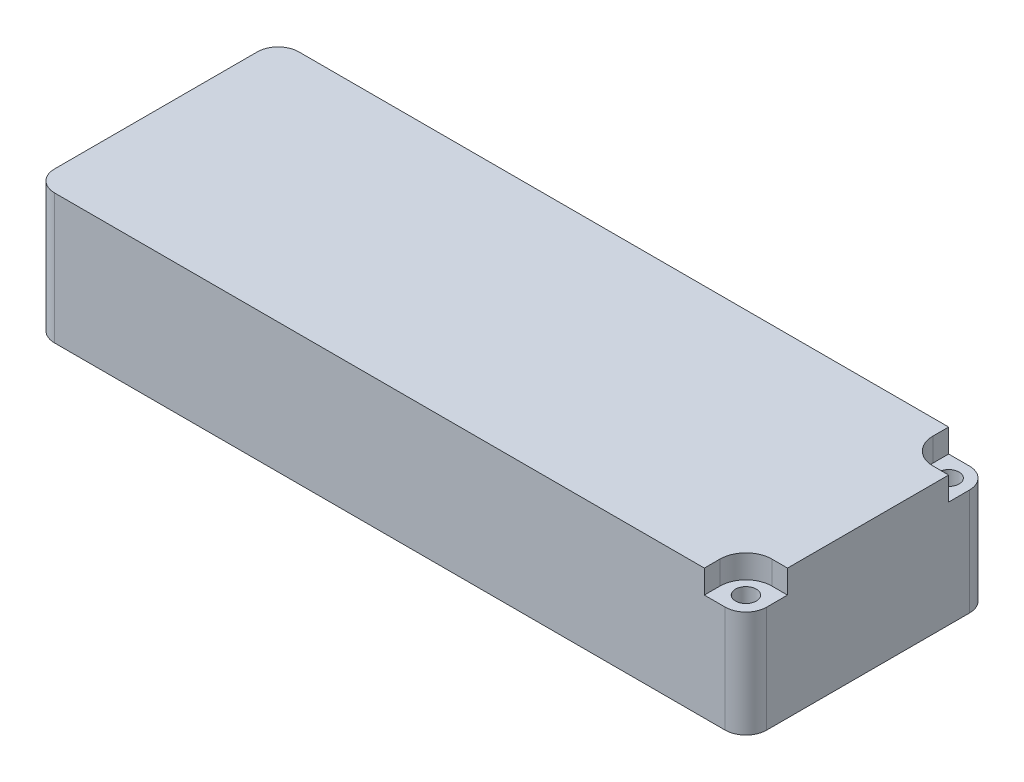
ISO-10303-21;
HEADER;
FILE_DESCRIPTION(('STEP AP214'),'2;1');
FILE_NAME('part.step','',(''),(''),'','','');
FILE_SCHEMA(('AUTOMOTIVE_DESIGN { 1 0 10303 214 1 1 1 1 }'));
ENDSEC;
DATA;
#1=APPLICATION_CONTEXT('core data for automotive mechanical design processes');
#2=APPLICATION_PROTOCOL_DEFINITION('international standard','automotive_design',2000,#1);
#3=PRODUCT_CONTEXT('',#1,'mechanical');
#4=PRODUCT('Part','Part','',(#3));
#5=PRODUCT_RELATED_PRODUCT_CATEGORY('part','',(#4));
#6=PRODUCT_DEFINITION_FORMATION('','',#4);
#7=PRODUCT_DEFINITION_CONTEXT('part definition',#1,'design');
#8=PRODUCT_DEFINITION('design','',#6,#7);
#9=PRODUCT_DEFINITION_SHAPE('','',#8);
#10=(LENGTH_UNIT() NAMED_UNIT(*) SI_UNIT(.MILLI.,.METRE.));
#11=(NAMED_UNIT(*) PLANE_ANGLE_UNIT() SI_UNIT($,.RADIAN.));
#12=(NAMED_UNIT(*) SI_UNIT($,.STERADIAN.) SOLID_ANGLE_UNIT());
#13=UNCERTAINTY_MEASURE_WITH_UNIT(LENGTH_MEASURE(1.E-05),#10,'distance_accuracy_value','');
#14=(GEOMETRIC_REPRESENTATION_CONTEXT(3) GLOBAL_UNCERTAINTY_ASSIGNED_CONTEXT((#13)) GLOBAL_UNIT_ASSIGNED_CONTEXT((#10,
#11,#12)) REPRESENTATION_CONTEXT('',''));
#15=CARTESIAN_POINT('',(0.,0.,0.));
#16=DIRECTION('',(0.,0.,1.));
#17=DIRECTION('',(1.,0.,0.));
#18=AXIS2_PLACEMENT_3D('',#15,#16,#17);
#19=CARTESIAN_POINT('',(64.5,25.,-19.5));
#20=DIRECTION('',(0.,1.,0.));
#21=DIRECTION('',(0.,0.,1.));
#22=AXIS2_PLACEMENT_3D('',#19,#20,#21);
#23=CYLINDRICAL_SURFACE('',#22,4.);
#24=DIRECTION('',(0.,-1.,0.));
#25=VECTOR('',#24,1.);
#26=CARTESIAN_POINT('',(64.5,0.,-23.5));
#27=LINE('',#26,#25);
#28=CARTESIAN_POINT('',(64.5,20.5,-23.5));
#29=VERTEX_POINT('',#28);
#30=CARTESIAN_POINT('',(64.5,0.,-23.5));
#31=VERTEX_POINT('',#30);
#32=EDGE_CURVE('E226',#29,#31,#27,.T.);
#33=ORIENTED_EDGE('',*,*,#32,.F.);
#34=CARTESIAN_POINT('',(64.5,20.5,-19.5));
#35=DIRECTION('',(0.,1.,0.));
#36=DIRECTION('',(0.,0.,1.));
#37=AXIS2_PLACEMENT_3D('',#34,#35,#36);
#38=CIRCLE('',#37,4.);
#39=CARTESIAN_POINT('',(68.5,20.5,-19.5));
#40=VERTEX_POINT('',#39);
#41=EDGE_CURVE('E245',#29,#40,#38,.F.);
#42=ORIENTED_EDGE('',*,*,#41,.T.);
#43=DIRECTION('',(0.,-1.,0.));
#44=VECTOR('',#43,1.);
#45=CARTESIAN_POINT('',(68.5,25.,-19.5));
#46=LINE('',#45,#44);
#47=CARTESIAN_POINT('',(68.5,0.,-19.5));
#48=VERTEX_POINT('',#47);
#49=EDGE_CURVE('E236',#48,#40,#46,.F.);
#50=ORIENTED_EDGE('',*,*,#49,.F.);
#51=CARTESIAN_POINT('',(64.5,0.,-19.5));
#52=DIRECTION('',(0.,-1.,0.));
#53=DIRECTION('',(0.,0.,-1.));
#54=AXIS2_PLACEMENT_3D('',#51,#52,#53);
#55=CIRCLE('',#54,4.);
#56=EDGE_CURVE('E222',#31,#48,#55,.T.);
#57=ORIENTED_EDGE('',*,*,#56,.F.);
#58=EDGE_LOOP('',(#33,#42,#50,#57));
#59=FACE_BOUND('',#58,.T.);
#60=ADVANCED_FACE('F33',(#59),#23,.T.);
#61=CARTESIAN_POINT('',(-68.5,25.,23.5));
#62=DIRECTION('',(-1.,0.,0.));
#63=DIRECTION('',(0.,0.,1.));
#64=AXIS2_PLACEMENT_3D('',#61,#62,#63);
#65=PLANE('',#64);
#66=DIRECTION('',(0.,0.,-1.));
#67=VECTOR('',#66,1.);
#68=CARTESIAN_POINT('',(-68.5,25.,23.5));
#69=LINE('',#68,#67);
#70=CARTESIAN_POINT('',(-68.5,25.,19.5));
#71=VERTEX_POINT('',#70);
#72=CARTESIAN_POINT('',(-68.5,25.,-19.5));
#73=VERTEX_POINT('',#72);
#74=EDGE_CURVE('E192',#71,#73,#69,.T.);
#75=ORIENTED_EDGE('',*,*,#74,.T.);
#76=DIRECTION('',(0.,-1.,0.));
#77=VECTOR('',#76,1.);
#78=CARTESIAN_POINT('',(-68.5,25.,-19.5));
#79=LINE('',#78,#77);
#80=CARTESIAN_POINT('',(-68.5,0.,-19.5));
#81=VERTEX_POINT('',#80);
#82=EDGE_CURVE('E215',#73,#81,#79,.T.);
#83=ORIENTED_EDGE('',*,*,#82,.T.);
#84=DIRECTION('',(0.,0.,-1.));
#85=VECTOR('',#84,1.);
#86=CARTESIAN_POINT('',(-68.5,0.,23.5));
#87=LINE('',#86,#85);
#88=CARTESIAN_POINT('',(-68.5,0.,19.5));
#89=VERTEX_POINT('',#88);
#90=EDGE_CURVE('E190',#89,#81,#87,.T.);
#91=ORIENTED_EDGE('',*,*,#90,.F.);
#92=DIRECTION('',(0.,-1.,0.));
#93=VECTOR('',#92,1.);
#94=CARTESIAN_POINT('',(-68.5,25.,19.5));
#95=LINE('',#94,#93);
#96=EDGE_CURVE('E203',#89,#71,#95,.F.);
#97=ORIENTED_EDGE('',*,*,#96,.T.);
#98=EDGE_LOOP('',(#75,#83,#91,#97));
#99=FACE_BOUND('',#98,.T.);
#100=ADVANCED_FACE('F297',(#99),#65,.T.);
#101=CARTESIAN_POINT('',(-68.5,25.,23.5));
#102=DIRECTION('',(0.,0.,-1.));
#103=DIRECTION('',(-1.,0.,0.));
#104=AXIS2_PLACEMENT_3D('',#101,#102,#103);
#105=PLANE('',#104);
#106=DIRECTION('',(1.,0.,0.));
#107=VECTOR('',#106,1.);
#108=CARTESIAN_POINT('',(68.5,20.5,23.5));
#109=LINE('',#108,#107);
#110=CARTESIAN_POINT('',(60.5,20.5,23.5));
#111=VERTEX_POINT('',#110);
#112=CARTESIAN_POINT('',(64.5,20.5,23.5));
#113=VERTEX_POINT('',#112);
#114=EDGE_CURVE('E166',#111,#113,#109,.T.);
#115=ORIENTED_EDGE('',*,*,#114,.F.);
#116=DIRECTION('',(0.,1.,0.));
#117=VECTOR('',#116,1.);
#118=CARTESIAN_POINT('',(60.5,20.5,23.5));
#119=LINE('',#118,#117);
#120=CARTESIAN_POINT('',(60.5,25.,23.5));
#121=VERTEX_POINT('',#120);
#122=EDGE_CURVE('E165',#111,#121,#119,.T.);
#123=ORIENTED_EDGE('',*,*,#122,.T.);
#124=DIRECTION('',(1.,0.,0.));
#125=VECTOR('',#124,1.);
#126=CARTESIAN_POINT('',(-68.5,25.,23.5));
#127=LINE('',#126,#125);
#128=CARTESIAN_POINT('',(-64.5,25.,23.5));
#129=VERTEX_POINT('',#128);
#130=EDGE_CURVE('E200',#129,#121,#127,.T.);
#131=ORIENTED_EDGE('',*,*,#130,.F.);
#132=DIRECTION('',(0.,-1.,0.));
#133=VECTOR('',#132,1.);
#134=CARTESIAN_POINT('',(-64.5,0.,23.5));
#135=LINE('',#134,#133);
#136=CARTESIAN_POINT('',(-64.5,0.,23.5));
#137=VERTEX_POINT('',#136);
#138=EDGE_CURVE('E239',#129,#137,#135,.T.);
#139=ORIENTED_EDGE('',*,*,#138,.T.);
#140=DIRECTION('',(1.,0.,0.));
#141=VECTOR('',#140,1.);
#142=CARTESIAN_POINT('',(-68.5,0.,23.5));
#143=LINE('',#142,#141);
#144=CARTESIAN_POINT('',(64.5,0.,23.5));
#145=VERTEX_POINT('',#144);
#146=EDGE_CURVE('E196',#137,#145,#143,.T.);
#147=ORIENTED_EDGE('',*,*,#146,.T.);
#148=DIRECTION('',(0.,-1.,0.));
#149=VECTOR('',#148,1.);
#150=CARTESIAN_POINT('',(64.5,25.,23.5));
#151=LINE('',#150,#149);
#152=EDGE_CURVE('E242',#145,#113,#151,.F.);
#153=ORIENTED_EDGE('',*,*,#152,.T.);
#154=EDGE_LOOP('',(#115,#123,#131,#139,#147,#153));
#155=FACE_BOUND('',#154,.T.);
#156=ADVANCED_FACE('F309',(#155),#105,.F.);
#157=CARTESIAN_POINT('',(68.5,25.,23.5));
#158=DIRECTION('',(-1.,0.,0.));
#159=DIRECTION('',(0.,0.,1.));
#160=AXIS2_PLACEMENT_3D('',#157,#158,#159);
#161=PLANE('',#160);
#162=DIRECTION('',(0.,0.,-1.));
#163=VECTOR('',#162,1.);
#164=CARTESIAN_POINT('',(68.5,25.,23.5));
#165=LINE('',#164,#163);
#166=CARTESIAN_POINT('',(68.5,25.,15.5));
#167=VERTEX_POINT('',#166);
#168=CARTESIAN_POINT('',(68.5,25.,-15.5));
#169=VERTEX_POINT('',#168);
#170=EDGE_CURVE('E164',#167,#169,#165,.T.);
#171=ORIENTED_EDGE('',*,*,#170,.F.);
#172=DIRECTION('',(0.,1.,0.));
#173=VECTOR('',#172,1.);
#174=CARTESIAN_POINT('',(68.5,20.5,15.5));
#175=LINE('',#174,#173);
#176=CARTESIAN_POINT('',(68.5,20.5,15.5));
#177=VERTEX_POINT('',#176);
#178=EDGE_CURVE('E157',#177,#167,#175,.T.);
#179=ORIENTED_EDGE('',*,*,#178,.F.);
#180=DIRECTION('',(0.,0.,-1.));
#181=VECTOR('',#180,1.);
#182=CARTESIAN_POINT('',(68.5,20.5,15.5));
#183=LINE('',#182,#181);
#184=CARTESIAN_POINT('',(68.5,20.5,19.5));
#185=VERTEX_POINT('',#184);
#186=EDGE_CURVE('E145',#185,#177,#183,.T.);
#187=ORIENTED_EDGE('',*,*,#186,.F.);
#188=DIRECTION('',(0.,-1.,0.));
#189=VECTOR('',#188,1.);
#190=CARTESIAN_POINT('',(68.5,25.,19.5));
#191=LINE('',#190,#189);
#192=CARTESIAN_POINT('',(68.5,0.,19.5));
#193=VERTEX_POINT('',#192);
#194=EDGE_CURVE('E234',#185,#193,#191,.T.);
#195=ORIENTED_EDGE('',*,*,#194,.T.);
#196=DIRECTION('',(0.,0.,-1.));
#197=VECTOR('',#196,1.);
#198=CARTESIAN_POINT('',(68.5,0.,23.5));
#199=LINE('',#198,#197);
#200=EDGE_CURVE('E209',#193,#48,#199,.T.);
#201=ORIENTED_EDGE('',*,*,#200,.T.);
#202=ORIENTED_EDGE('',*,*,#49,.T.);
#203=DIRECTION('',(0.,0.,-1.));
#204=VECTOR('',#203,1.);
#205=CARTESIAN_POINT('',(68.5,20.5,-15.5));
#206=LINE('',#205,#204);
#207=CARTESIAN_POINT('',(68.5,20.5,-15.5));
#208=VERTEX_POINT('',#207);
#209=EDGE_CURVE('E182',#208,#40,#206,.T.);
#210=ORIENTED_EDGE('',*,*,#209,.F.);
#211=DIRECTION('',(0.,1.,0.));
#212=VECTOR('',#211,1.);
#213=CARTESIAN_POINT('',(68.5,20.5,-15.5));
#214=LINE('',#213,#212);
#215=EDGE_CURVE('E188',#208,#169,#214,.T.);
#216=ORIENTED_EDGE('',*,*,#215,.T.);
#217=EDGE_LOOP('',(#171,#179,#187,#195,#201,#202,#210,#216));
#218=FACE_BOUND('',#217,.T.);
#219=ADVANCED_FACE('F161',(#218),#161,.F.);
#220=CARTESIAN_POINT('',(-68.5,25.,-23.5));
#221=DIRECTION('',(0.,0.,-1.));
#222=DIRECTION('',(-1.,0.,0.));
#223=AXIS2_PLACEMENT_3D('',#220,#221,#222);
#224=PLANE('',#223);
#225=DIRECTION('',(0.,1.,0.));
#226=VECTOR('',#225,1.);
#227=CARTESIAN_POINT('',(60.5,20.5,-23.5));
#228=LINE('',#227,#226);
#229=CARTESIAN_POINT('',(60.5,20.5,-23.5));
#230=VERTEX_POINT('',#229);
#231=CARTESIAN_POINT('',(60.5,25.,-23.5));
#232=VERTEX_POINT('',#231);
#233=EDGE_CURVE('E184',#230,#232,#228,.T.);
#234=ORIENTED_EDGE('',*,*,#233,.F.);
#235=DIRECTION('',(-1.,0.,0.));
#236=VECTOR('',#235,1.);
#237=CARTESIAN_POINT('',(68.5,20.5,-23.5));
#238=LINE('',#237,#236);
#239=EDGE_CURVE('E174',#29,#230,#238,.T.);
#240=ORIENTED_EDGE('',*,*,#239,.F.);
#241=ORIENTED_EDGE('',*,*,#32,.T.);
#242=DIRECTION('',(1.,0.,0.));
#243=VECTOR('',#242,1.);
#244=CARTESIAN_POINT('',(-68.5,0.,-23.5));
#245=LINE('',#244,#243);
#246=CARTESIAN_POINT('',(-64.5,0.,-23.5));
#247=VERTEX_POINT('',#246);
#248=EDGE_CURVE('E206',#247,#31,#245,.T.);
#249=ORIENTED_EDGE('',*,*,#248,.F.);
#250=DIRECTION('',(0.,-1.,0.));
#251=VECTOR('',#250,1.);
#252=CARTESIAN_POINT('',(-64.5,25.,-23.5));
#253=LINE('',#252,#251);
#254=CARTESIAN_POINT('',(-64.5,25.,-23.5));
#255=VERTEX_POINT('',#254);
#256=EDGE_CURVE('E228',#247,#255,#253,.F.);
#257=ORIENTED_EDGE('',*,*,#256,.T.);
#258=DIRECTION('',(1.,0.,0.));
#259=VECTOR('',#258,1.);
#260=CARTESIAN_POINT('',(-68.5,25.,-23.5));
#261=LINE('',#260,#259);
#262=EDGE_CURVE('E195',#255,#232,#261,.T.);
#263=ORIENTED_EDGE('',*,*,#262,.T.);
#264=EDGE_LOOP('',(#234,#240,#241,#249,#257,#263));
#265=FACE_BOUND('',#264,.T.);
#266=ADVANCED_FACE('F288',(#265),#224,.T.);
#267=CARTESIAN_POINT('',(0.,25.,0.));
#268=DIRECTION('',(0.,-1.,0.));
#269=DIRECTION('',(0.,0.,-1.));
#270=AXIS2_PLACEMENT_3D('',#267,#268,#269);
#271=PLANE('',#270);
#272=ORIENTED_EDGE('',*,*,#130,.T.);
#273=DIRECTION('',(0.,0.,1.));
#274=VECTOR('',#273,1.);
#275=CARTESIAN_POINT('',(60.5,25.,23.5));
#276=LINE('',#275,#274);
#277=CARTESIAN_POINT('',(60.5,25.,20.5));
#278=VERTEX_POINT('',#277);
#279=EDGE_CURVE('E154',#278,#121,#276,.T.);
#280=ORIENTED_EDGE('',*,*,#279,.F.);
#281=CARTESIAN_POINT('',(65.5,25.,20.5));
#282=DIRECTION('',(0.,-1.,0.));
#283=DIRECTION('',(0.,0.,-1.));
#284=AXIS2_PLACEMENT_3D('',#281,#282,#283);
#285=CIRCLE('',#284,5.);
#286=CARTESIAN_POINT('',(65.5,25.,15.5));
#287=VERTEX_POINT('',#286);
#288=EDGE_CURVE('E11',#278,#287,#285,.T.);
#289=ORIENTED_EDGE('',*,*,#288,.T.);
#290=DIRECTION('',(-1.,0.,0.));
#291=VECTOR('',#290,1.);
#292=CARTESIAN_POINT('',(60.5,25.,15.5));
#293=LINE('',#292,#291);
#294=EDGE_CURVE('E313',#167,#287,#293,.T.);
#295=ORIENTED_EDGE('',*,*,#294,.F.);
#296=ORIENTED_EDGE('',*,*,#170,.T.);
#297=DIRECTION('',(1.,0.,0.));
#298=VECTOR('',#297,1.);
#299=CARTESIAN_POINT('',(60.5,25.,-15.5));
#300=LINE('',#299,#298);
#301=CARTESIAN_POINT('',(65.5,25.,-15.5));
#302=VERTEX_POINT('',#301);
#303=EDGE_CURVE('E177',#302,#169,#300,.T.);
#304=ORIENTED_EDGE('',*,*,#303,.F.);
#305=CARTESIAN_POINT('',(65.5,25.,-20.5));
#306=DIRECTION('',(0.,-1.,0.));
#307=DIRECTION('',(0.,0.,-1.));
#308=AXIS2_PLACEMENT_3D('',#305,#306,#307);
#309=CIRCLE('',#308,5.);
#310=CARTESIAN_POINT('',(60.5,25.,-20.5));
#311=VERTEX_POINT('',#310);
#312=EDGE_CURVE('E41',#302,#311,#309,.T.);
#313=ORIENTED_EDGE('',*,*,#312,.T.);
#314=DIRECTION('',(0.,0.,1.));
#315=VECTOR('',#314,1.);
#316=CARTESIAN_POINT('',(60.5,25.,-23.5));
#317=LINE('',#316,#315);
#318=EDGE_CURVE('E169',#232,#311,#317,.T.);
#319=ORIENTED_EDGE('',*,*,#318,.F.);
#320=ORIENTED_EDGE('',*,*,#262,.F.);
#321=CARTESIAN_POINT('',(-64.5,25.,-19.5));
#322=DIRECTION('',(0.,-1.,0.));
#323=DIRECTION('',(0.,0.,-1.));
#324=AXIS2_PLACEMENT_3D('',#321,#322,#323);
#325=CIRCLE('',#324,4.);
#326=EDGE_CURVE('E232',#255,#73,#325,.F.);
#327=ORIENTED_EDGE('',*,*,#326,.T.);
#328=ORIENTED_EDGE('',*,*,#74,.F.);
#329=CARTESIAN_POINT('',(-64.5,25.,19.5));
#330=DIRECTION('',(0.,-1.,0.));
#331=DIRECTION('',(0.,0.,-1.));
#332=AXIS2_PLACEMENT_3D('',#329,#330,#331);
#333=CIRCLE('',#332,4.);
#334=EDGE_CURVE('E230',#71,#129,#333,.F.);
#335=ORIENTED_EDGE('',*,*,#334,.T.);
#336=EDGE_LOOP('',(#272,#280,#289,#295,#296,#304,#313,#319,#320,#327,#328,#335));
#337=FACE_BOUND('',#336,.T.);
#338=ADVANCED_FACE('F263',(#337),#271,.F.);
#339=CARTESIAN_POINT('',(0.,0.,0.));
#340=DIRECTION('',(0.,-1.,0.));
#341=DIRECTION('',(0.,0.,-1.));
#342=AXIS2_PLACEMENT_3D('',#339,#340,#341);
#343=PLANE('',#342);
#344=ORIENTED_EDGE('',*,*,#90,.T.);
#345=CARTESIAN_POINT('',(-64.5,0.,-19.5));
#346=DIRECTION('',(0.,-1.,0.));
#347=DIRECTION('',(0.,0.,-1.));
#348=AXIS2_PLACEMENT_3D('',#345,#346,#347);
#349=CIRCLE('',#348,4.);
#350=EDGE_CURVE('E224',#81,#247,#349,.T.);
#351=ORIENTED_EDGE('',*,*,#350,.T.);
#352=ORIENTED_EDGE('',*,*,#248,.T.);
#353=ORIENTED_EDGE('',*,*,#56,.T.);
#354=ORIENTED_EDGE('',*,*,#200,.F.);
#355=CARTESIAN_POINT('',(64.5,0.,19.5));
#356=DIRECTION('',(0.,-1.,0.));
#357=DIRECTION('',(0.,0.,-1.));
#358=AXIS2_PLACEMENT_3D('',#355,#356,#357);
#359=CIRCLE('',#358,4.);
#360=EDGE_CURVE('E220',#193,#145,#359,.T.);
#361=ORIENTED_EDGE('',*,*,#360,.T.);
#362=ORIENTED_EDGE('',*,*,#146,.F.);
#363=CARTESIAN_POINT('',(-64.5,0.,19.5));
#364=DIRECTION('',(0.,-1.,0.));
#365=DIRECTION('',(0.,0.,-1.));
#366=AXIS2_PLACEMENT_3D('',#363,#364,#365);
#367=CIRCLE('',#366,4.);
#368=EDGE_CURVE('E218',#137,#89,#367,.T.);
#369=ORIENTED_EDGE('',*,*,#368,.T.);
#370=EDGE_LOOP('',(#344,#351,#352,#353,#354,#361,#362,#369));
#371=FACE_BOUND('',#370,.T.);
#372=ADVANCED_FACE('F300',(#371),#343,.T.);
#373=CARTESIAN_POINT('',(-64.5,25.,-19.5));
#374=DIRECTION('',(0.,-1.,0.));
#375=DIRECTION('',(0.,0.,-1.));
#376=AXIS2_PLACEMENT_3D('',#373,#374,#375);
#377=CYLINDRICAL_SURFACE('',#376,4.);
#378=ORIENTED_EDGE('',*,*,#326,.F.);
#379=ORIENTED_EDGE('',*,*,#256,.F.);
#380=ORIENTED_EDGE('',*,*,#350,.F.);
#381=ORIENTED_EDGE('',*,*,#82,.F.);
#382=EDGE_LOOP('',(#378,#379,#380,#381));
#383=FACE_BOUND('',#382,.T.);
#384=ADVANCED_FACE('F294',(#383),#377,.T.);
#385=CARTESIAN_POINT('',(64.5,25.,19.5));
#386=DIRECTION('',(0.,-1.,0.));
#387=DIRECTION('',(0.,0.,-1.));
#388=AXIS2_PLACEMENT_3D('',#385,#386,#387);
#389=CYLINDRICAL_SURFACE('',#388,4.);
#390=CARTESIAN_POINT('',(64.5,20.5,19.5));
#391=DIRECTION('',(0.,-1.,0.));
#392=DIRECTION('',(0.,0.,-1.));
#393=AXIS2_PLACEMENT_3D('',#390,#391,#392);
#394=CIRCLE('',#393,4.);
#395=EDGE_CURVE('E150',#113,#185,#394,.F.);
#396=ORIENTED_EDGE('',*,*,#395,.F.);
#397=ORIENTED_EDGE('',*,*,#152,.F.);
#398=ORIENTED_EDGE('',*,*,#360,.F.);
#399=ORIENTED_EDGE('',*,*,#194,.F.);
#400=EDGE_LOOP('',(#396,#397,#398,#399));
#401=FACE_BOUND('',#400,.T.);
#402=ADVANCED_FACE('F358',(#401),#389,.T.);
#403=CARTESIAN_POINT('',(-64.5,25.,19.5));
#404=DIRECTION('',(0.,1.,0.));
#405=DIRECTION('',(0.,0.,1.));
#406=AXIS2_PLACEMENT_3D('',#403,#404,#405);
#407=CYLINDRICAL_SURFACE('',#406,4.);
#408=ORIENTED_EDGE('',*,*,#334,.F.);
#409=ORIENTED_EDGE('',*,*,#96,.F.);
#410=ORIENTED_EDGE('',*,*,#368,.F.);
#411=ORIENTED_EDGE('',*,*,#138,.F.);
#412=EDGE_LOOP('',(#408,#409,#410,#411));
#413=FACE_BOUND('',#412,.T.);
#414=ADVANCED_FACE('F305',(#413),#407,.T.);
#415=CARTESIAN_POINT('',(60.5,20.5,-15.5));
#416=DIRECTION('',(0.,0.,1.));
#417=DIRECTION('',(1.,0.,0.));
#418=AXIS2_PLACEMENT_3D('',#415,#416,#417);
#419=PLANE('',#418);
#420=DIRECTION('',(1.,0.,0.));
#421=VECTOR('',#420,1.);
#422=CARTESIAN_POINT('',(60.5,20.5,-15.5));
#423=LINE('',#422,#421);
#424=CARTESIAN_POINT('',(65.5,20.5,-15.5));
#425=VERTEX_POINT('',#424);
#426=EDGE_CURVE('E180',#425,#208,#423,.T.);
#427=ORIENTED_EDGE('',*,*,#426,.F.);
#428=DIRECTION('',(0.,1.,0.));
#429=VECTOR('',#428,1.);
#430=CARTESIAN_POINT('',(65.5,25.,-15.5));
#431=LINE('',#430,#429);
#432=EDGE_CURVE('E249',#425,#302,#431,.T.);
#433=ORIENTED_EDGE('',*,*,#432,.T.);
#434=ORIENTED_EDGE('',*,*,#303,.T.);
#435=ORIENTED_EDGE('',*,*,#215,.F.);
#436=EDGE_LOOP('',(#427,#433,#434,#435));
#437=FACE_BOUND('',#436,.T.);
#438=ADVANCED_FACE('F279',(#437),#419,.F.);
#439=CARTESIAN_POINT('',(60.5,20.5,-23.5));
#440=DIRECTION('',(-1.,0.,0.));
#441=DIRECTION('',(0.,0.,1.));
#442=AXIS2_PLACEMENT_3D('',#439,#440,#441);
#443=PLANE('',#442);
#444=ORIENTED_EDGE('',*,*,#318,.T.);
#445=DIRECTION('',(0.,1.,0.));
#446=VECTOR('',#445,1.);
#447=CARTESIAN_POINT('',(60.5,20.5,-20.5));
#448=LINE('',#447,#446);
#449=CARTESIAN_POINT('',(60.5,20.5,-20.5));
#450=VERTEX_POINT('',#449);
#451=EDGE_CURVE('E252',#311,#450,#448,.F.);
#452=ORIENTED_EDGE('',*,*,#451,.T.);
#453=DIRECTION('',(0.,0.,1.));
#454=VECTOR('',#453,1.);
#455=CARTESIAN_POINT('',(60.5,20.5,-23.5));
#456=LINE('',#455,#454);
#457=EDGE_CURVE('E176',#230,#450,#456,.T.);
#458=ORIENTED_EDGE('',*,*,#457,.F.);
#459=ORIENTED_EDGE('',*,*,#233,.T.);
#460=EDGE_LOOP('',(#444,#452,#458,#459));
#461=FACE_BOUND('',#460,.T.);
#462=ADVANCED_FACE('F269',(#461),#443,.F.);
#463=CARTESIAN_POINT('',(0.,20.5,0.));
#464=DIRECTION('',(0.,1.,0.));
#465=DIRECTION('',(0.,0.,1.));
#466=AXIS2_PLACEMENT_3D('',#463,#464,#465);
#467=PLANE('',#466);
#468=CARTESIAN_POINT('',(64.5,20.5,-19.5));
#469=DIRECTION('',(0.,1.,0.));
#470=DIRECTION('',(0.,0.,1.));
#471=AXIS2_PLACEMENT_3D('',#468,#469,#470);
#472=CIRCLE('',#471,2.);
#473=CARTESIAN_POINT('',(64.5,20.5,-17.5));
#474=VERTEX_POINT('',#473);
#475=EDGE_CURVE('E324',#474,#474,#472,.T.);
#476=ORIENTED_EDGE('',*,*,#475,.F.);
#477=EDGE_LOOP('',(#476));
#478=FACE_BOUND('',#477,.T.);
#479=ORIENTED_EDGE('',*,*,#457,.T.);
#480=CARTESIAN_POINT('',(65.5,20.5,-20.5));
#481=DIRECTION('',(0.,1.,0.));
#482=DIRECTION('',(0.,0.,1.));
#483=AXIS2_PLACEMENT_3D('',#480,#481,#482);
#484=CIRCLE('',#483,5.);
#485=EDGE_CURVE('E254',#450,#425,#484,.T.);
#486=ORIENTED_EDGE('',*,*,#485,.T.);
#487=ORIENTED_EDGE('',*,*,#426,.T.);
#488=ORIENTED_EDGE('',*,*,#209,.T.);
#489=ORIENTED_EDGE('',*,*,#41,.F.);
#490=ORIENTED_EDGE('',*,*,#239,.T.);
#491=EDGE_LOOP('',(#479,#486,#487,#488,#489,#490));
#492=FACE_BOUND('',#491,.T.);
#493=ADVANCED_FACE('F276',(#478,#492),#467,.T.);
#494=CARTESIAN_POINT('',(60.5,20.5,23.5));
#495=DIRECTION('',(-1.,0.,0.));
#496=DIRECTION('',(0.,0.,1.));
#497=AXIS2_PLACEMENT_3D('',#494,#495,#496);
#498=PLANE('',#497);
#499=DIRECTION('',(0.,0.,1.));
#500=VECTOR('',#499,1.);
#501=CARTESIAN_POINT('',(60.5,20.5,23.5));
#502=LINE('',#501,#500);
#503=CARTESIAN_POINT('',(60.5,20.5,20.5));
#504=VERTEX_POINT('',#503);
#505=EDGE_CURVE('E158',#504,#111,#502,.T.);
#506=ORIENTED_EDGE('',*,*,#505,.F.);
#507=DIRECTION('',(0.,1.,0.));
#508=VECTOR('',#507,1.);
#509=CARTESIAN_POINT('',(60.5,25.,20.5));
#510=LINE('',#509,#508);
#511=EDGE_CURVE('E256',#504,#278,#510,.T.);
#512=ORIENTED_EDGE('',*,*,#511,.T.);
#513=ORIENTED_EDGE('',*,*,#279,.T.);
#514=ORIENTED_EDGE('',*,*,#122,.F.);
#515=EDGE_LOOP('',(#506,#512,#513,#514));
#516=FACE_BOUND('',#515,.T.);
#517=ADVANCED_FACE('F340',(#516),#498,.F.);
#518=CARTESIAN_POINT('',(60.5,20.5,15.5));
#519=DIRECTION('',(0.,0.,-1.));
#520=DIRECTION('',(-1.,0.,0.));
#521=AXIS2_PLACEMENT_3D('',#518,#519,#520);
#522=PLANE('',#521);
#523=ORIENTED_EDGE('',*,*,#294,.T.);
#524=DIRECTION('',(0.,1.,0.));
#525=VECTOR('',#524,1.);
#526=CARTESIAN_POINT('',(65.5,20.5,15.5));
#527=LINE('',#526,#525);
#528=CARTESIAN_POINT('',(65.5,20.5,15.5));
#529=VERTEX_POINT('',#528);
#530=EDGE_CURVE('E48',#287,#529,#527,.F.);
#531=ORIENTED_EDGE('',*,*,#530,.T.);
#532=DIRECTION('',(-1.,0.,0.));
#533=VECTOR('',#532,1.);
#534=CARTESIAN_POINT('',(60.5,20.5,15.5));
#535=LINE('',#534,#533);
#536=EDGE_CURVE('E147',#177,#529,#535,.T.);
#537=ORIENTED_EDGE('',*,*,#536,.F.);
#538=ORIENTED_EDGE('',*,*,#178,.T.);
#539=EDGE_LOOP('',(#523,#531,#537,#538));
#540=FACE_BOUND('',#539,.T.);
#541=ADVANCED_FACE('F156',(#540),#522,.F.);
#542=CARTESIAN_POINT('',(0.,20.5,0.));
#543=DIRECTION('',(0.,-1.,0.));
#544=DIRECTION('',(0.,0.,-1.));
#545=AXIS2_PLACEMENT_3D('',#542,#543,#544);
#546=PLANE('',#545);
#547=CARTESIAN_POINT('',(64.5,20.5,19.5));
#548=DIRECTION('',(0.,1.,0.));
#549=DIRECTION('',(0.,0.,-1.));
#550=AXIS2_PLACEMENT_3D('',#547,#548,#549);
#551=CIRCLE('',#550,2.);
#552=CARTESIAN_POINT('',(64.5,20.5,17.5));
#553=VERTEX_POINT('',#552);
#554=EDGE_CURVE('E318',#553,#553,#551,.T.);
#555=ORIENTED_EDGE('',*,*,#554,.F.);
#556=EDGE_LOOP('',(#555));
#557=FACE_BOUND('',#556,.T.);
#558=ORIENTED_EDGE('',*,*,#536,.T.);
#559=CARTESIAN_POINT('',(65.5,20.5,20.5));
#560=DIRECTION('',(0.,-1.,0.));
#561=DIRECTION('',(0.,0.,-1.));
#562=AXIS2_PLACEMENT_3D('',#559,#560,#561);
#563=CIRCLE('',#562,5.);
#564=EDGE_CURVE('E260',#529,#504,#563,.F.);
#565=ORIENTED_EDGE('',*,*,#564,.T.);
#566=ORIENTED_EDGE('',*,*,#505,.T.);
#567=ORIENTED_EDGE('',*,*,#114,.T.);
#568=ORIENTED_EDGE('',*,*,#395,.T.);
#569=ORIENTED_EDGE('',*,*,#186,.T.);
#570=EDGE_LOOP('',(#558,#565,#566,#567,#568,#569));
#571=FACE_BOUND('',#570,.T.);
#572=ADVANCED_FACE('F146',(#557,#571),#546,.F.);
#573=CARTESIAN_POINT('',(65.5,20.5,-20.5));
#574=DIRECTION('',(0.,-1.,0.));
#575=DIRECTION('',(0.,0.,-1.));
#576=AXIS2_PLACEMENT_3D('',#573,#574,#575);
#577=CYLINDRICAL_SURFACE('',#576,5.);
#578=ORIENTED_EDGE('',*,*,#485,.F.);
#579=ORIENTED_EDGE('',*,*,#451,.F.);
#580=ORIENTED_EDGE('',*,*,#312,.F.);
#581=ORIENTED_EDGE('',*,*,#432,.F.);
#582=EDGE_LOOP('',(#578,#579,#580,#581));
#583=FACE_BOUND('',#582,.T.);
#584=ADVANCED_FACE('F273',(#583),#577,.F.);
#585=CARTESIAN_POINT('',(65.5,20.5,20.5));
#586=DIRECTION('',(0.,-1.,0.));
#587=DIRECTION('',(0.,0.,-1.));
#588=AXIS2_PLACEMENT_3D('',#585,#586,#587);
#589=CYLINDRICAL_SURFACE('',#588,5.);
#590=ORIENTED_EDGE('',*,*,#564,.F.);
#591=ORIENTED_EDGE('',*,*,#530,.F.);
#592=ORIENTED_EDGE('',*,*,#288,.F.);
#593=ORIENTED_EDGE('',*,*,#511,.F.);
#594=EDGE_LOOP('',(#590,#591,#592,#593));
#595=FACE_BOUND('',#594,.T.);
#596=ADVANCED_FACE('F35',(#595),#589,.F.);
#597=CARTESIAN_POINT('',(64.5,10.5,19.5));
#598=DIRECTION('',(0.,1.,0.));
#599=DIRECTION('',(0.,0.,1.));
#600=AXIS2_PLACEMENT_3D('',#597,#598,#599);
#601=CYLINDRICAL_SURFACE('',#600,2.);
#602=CARTESIAN_POINT('',(64.5,10.5,19.5));
#603=DIRECTION('',(0.,1.,0.));
#604=DIRECTION('',(0.,0.,-1.));
#605=AXIS2_PLACEMENT_3D('',#602,#603,#604);
#606=CIRCLE('',#605,2.);
#607=CARTESIAN_POINT('',(64.5,10.5,17.5));
#608=VERTEX_POINT('',#607);
#609=EDGE_CURVE('E314',#608,#608,#606,.T.);
#610=ORIENTED_EDGE('',*,*,#609,.F.);
#611=EDGE_LOOP('',(#610));
#612=FACE_BOUND('',#611,.T.);
#613=ORIENTED_EDGE('',*,*,#554,.T.);
#614=EDGE_LOOP('',(#613));
#615=FACE_BOUND('',#614,.T.);
#616=ADVANCED_FACE('F368',(#612,#615),#601,.F.);
#617=CARTESIAN_POINT('',(64.5,10.5,19.5));
#618=DIRECTION('',(0.,-1.,0.));
#619=DIRECTION('',(0.,0.,-1.));
#620=AXIS2_PLACEMENT_3D('',#617,#618,#619);
#621=PLANE('',#620);
#622=ORIENTED_EDGE('',*,*,#609,.T.);
#623=EDGE_LOOP('',(#622));
#624=FACE_BOUND('',#623,.T.);
#625=ADVANCED_FACE('F335',(#624),#621,.F.);
#626=CARTESIAN_POINT('',(64.5,10.5,-19.5));
#627=DIRECTION('',(0.,1.,0.));
#628=DIRECTION('',(0.,0.,1.));
#629=AXIS2_PLACEMENT_3D('',#626,#627,#628);
#630=CYLINDRICAL_SURFACE('',#629,2.);
#631=CARTESIAN_POINT('',(64.5,10.5,-19.5));
#632=DIRECTION('',(0.,1.,0.));
#633=DIRECTION('',(0.,0.,1.));
#634=AXIS2_PLACEMENT_3D('',#631,#632,#633);
#635=CIRCLE('',#634,2.);
#636=CARTESIAN_POINT('',(64.5,10.5,-17.5));
#637=VERTEX_POINT('',#636);
#638=EDGE_CURVE('E321',#637,#637,#635,.T.);
#639=ORIENTED_EDGE('',*,*,#638,.F.);
#640=EDGE_LOOP('',(#639));
#641=FACE_BOUND('',#640,.T.);
#642=ORIENTED_EDGE('',*,*,#475,.T.);
#643=EDGE_LOOP('',(#642));
#644=FACE_BOUND('',#643,.T.);
#645=ADVANCED_FACE('F332',(#641,#644),#630,.F.);
#646=CARTESIAN_POINT('',(64.5,10.5,-19.5));
#647=DIRECTION('',(0.,1.,0.));
#648=DIRECTION('',(0.,0.,1.));
#649=AXIS2_PLACEMENT_3D('',#646,#647,#648);
#650=PLANE('',#649);
#651=ORIENTED_EDGE('',*,*,#638,.T.);
#652=EDGE_LOOP('',(#651));
#653=FACE_BOUND('',#652,.T.);
#654=ADVANCED_FACE('F330',(#653),#650,.T.);
#655=CLOSED_SHELL('',(#60,#100,#156,#219,#266,#338,#372,#384,#402,#414,#438,#462,#493,#517,#541,
#572,#584,#596,#616,#625,#645,#654));
#656=MANIFOLD_SOLID_BREP('B2',#655);
#657=ADVANCED_BREP_SHAPE_REPRESENTATION('',(#18,#656),#14);
#658=SHAPE_DEFINITION_REPRESENTATION(#9,#657);
ENDSEC;
END-ISO-10303-21;
